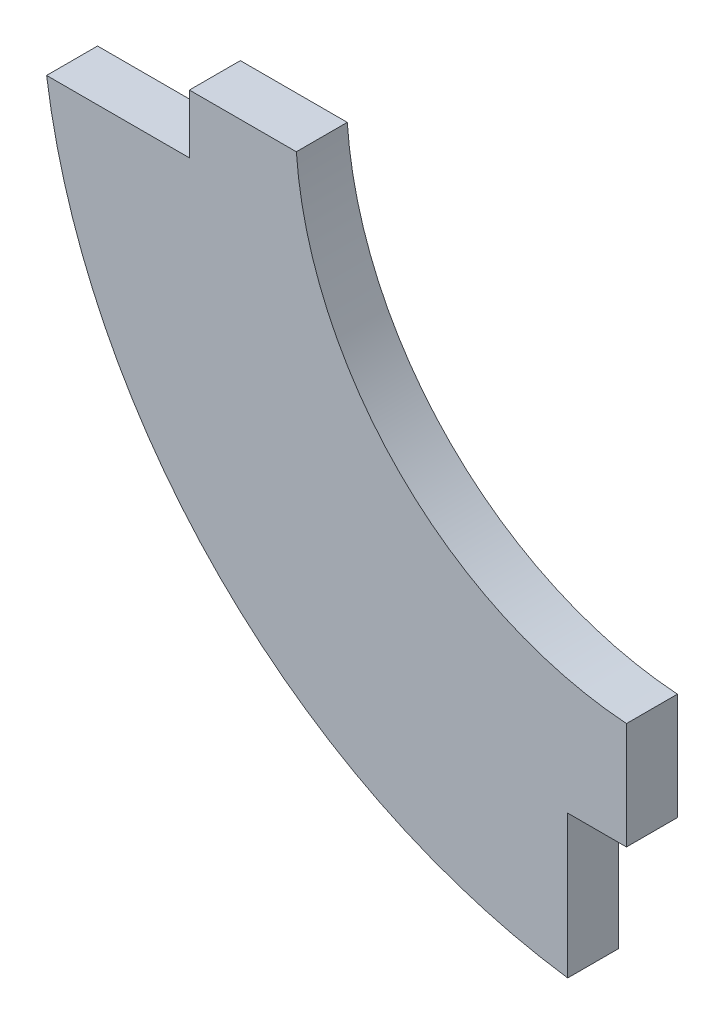
ISO-10303-21;
HEADER;
FILE_DESCRIPTION(('STEP AP214'),'2;1');
FILE_NAME('part.step','',(''),(''),'','','');
FILE_SCHEMA(('AUTOMOTIVE_DESIGN { 1 0 10303 214 1 1 1 1 }'));
ENDSEC;
DATA;
#1=APPLICATION_CONTEXT('core data for automotive mechanical design processes');
#2=APPLICATION_PROTOCOL_DEFINITION('international standard','automotive_design',2000,#1);
#3=PRODUCT_CONTEXT('',#1,'mechanical');
#4=PRODUCT('Part','Part','',(#3));
#5=PRODUCT_RELATED_PRODUCT_CATEGORY('part','',(#4));
#6=PRODUCT_DEFINITION_FORMATION('','',#4);
#7=PRODUCT_DEFINITION_CONTEXT('part definition',#1,'design');
#8=PRODUCT_DEFINITION('design','',#6,#7);
#9=PRODUCT_DEFINITION_SHAPE('','',#8);
#10=(LENGTH_UNIT() NAMED_UNIT(*) SI_UNIT(.MILLI.,.METRE.));
#11=(NAMED_UNIT(*) PLANE_ANGLE_UNIT() SI_UNIT($,.RADIAN.));
#12=(NAMED_UNIT(*) SI_UNIT($,.STERADIAN.) SOLID_ANGLE_UNIT());
#13=UNCERTAINTY_MEASURE_WITH_UNIT(LENGTH_MEASURE(1.E-05),#10,'distance_accuracy_value','');
#14=(GEOMETRIC_REPRESENTATION_CONTEXT(3) GLOBAL_UNCERTAINTY_ASSIGNED_CONTEXT((#13)) GLOBAL_UNIT_ASSIGNED_CONTEXT((#10,
#11,#12)) REPRESENTATION_CONTEXT('',''));
#15=CARTESIAN_POINT('',(0.,0.,0.));
#16=DIRECTION('',(0.,0.,1.));
#17=DIRECTION('',(1.,0.,0.));
#18=AXIS2_PLACEMENT_3D('',#15,#16,#17);
#19=CARTESIAN_POINT('',(-115.332,-20.9999999999975,6.35));
#20=DIRECTION('',(0.,-1.,0.));
#21=DIRECTION('',(1.,0.,0.));
#22=AXIS2_PLACEMENT_3D('',#19,#20,#21);
#23=PLANE('',#22);
#24=DIRECTION('',(-1.,0.,0.));
#25=VECTOR('',#24,1.);
#26=CARTESIAN_POINT('',(-115.332,-20.9999999999975,-6.35));
#27=LINE('',#26,#25);
#28=CARTESIAN_POINT('',(-115.332,-20.9999999999975,-6.35));
#29=VERTEX_POINT('',#28);
#30=CARTESIAN_POINT('',(-150.946215586878,-20.9999999999975,-6.35));
#31=VERTEX_POINT('',#30);
#32=EDGE_CURVE('E132',#29,#31,#27,.T.);
#33=ORIENTED_EDGE('',*,*,#32,.T.);
#34=DIRECTION('',(0.,0.,-1.));
#35=VECTOR('',#34,1.);
#36=CARTESIAN_POINT('',(-150.946215586878,-20.9999999999975,6.35));
#37=LINE('',#36,#35);
#38=CARTESIAN_POINT('',(-150.946215586878,-20.9999999999975,6.35));
#39=VERTEX_POINT('',#38);
#40=EDGE_CURVE('E11',#39,#31,#37,.T.);
#41=ORIENTED_EDGE('',*,*,#40,.F.);
#42=DIRECTION('',(-1.,0.,0.));
#43=VECTOR('',#42,1.);
#44=CARTESIAN_POINT('',(-115.332,-20.9999999999975,6.35));
#45=LINE('',#44,#43);
#46=CARTESIAN_POINT('',(-115.332,-20.9999999999975,6.35));
#47=VERTEX_POINT('',#46);
#48=EDGE_CURVE('E150',#47,#39,#45,.T.);
#49=ORIENTED_EDGE('',*,*,#48,.F.);
#50=DIRECTION('',(0.,0.,-1.));
#51=VECTOR('',#50,1.);
#52=CARTESIAN_POINT('',(-115.332,-20.9999999999975,6.35));
#53=LINE('',#52,#51);
#54=EDGE_CURVE('E131',#47,#29,#53,.T.);
#55=ORIENTED_EDGE('',*,*,#54,.T.);
#56=EDGE_LOOP('',(#33,#41,#49,#55));
#57=FACE_BOUND('',#56,.T.);
#58=ADVANCED_FACE('F34',(#57),#23,.F.);
#59=CARTESIAN_POINT('',(0.,0.,6.35));
#60=DIRECTION('',(0.,0.,-1.));
#61=DIRECTION('',(-1.,0.,0.));
#62=AXIS2_PLACEMENT_3D('',#59,#60,#61);
#63=CYLINDRICAL_SURFACE('',#62,152.4);
#64=CARTESIAN_POINT('',(0.,0.,-6.35));
#65=DIRECTION('',(0.,0.,1.));
#66=DIRECTION('',(1.,0.,0.));
#67=AXIS2_PLACEMENT_3D('',#64,#65,#66);
#68=CIRCLE('',#67,152.4);
#69=CARTESIAN_POINT('',(-20.9999999999946,-150.946215586878,-6.35));
#70=VERTEX_POINT('',#69);
#71=EDGE_CURVE('E135',#31,#70,#68,.T.);
#72=ORIENTED_EDGE('',*,*,#71,.T.);
#73=DIRECTION('',(0.,0.,-1.));
#74=VECTOR('',#73,1.);
#75=CARTESIAN_POINT('',(-20.9999999999946,-150.946215586878,6.35));
#76=LINE('',#75,#74);
#77=CARTESIAN_POINT('',(-20.9999999999946,-150.946215586878,6.35));
#78=VERTEX_POINT('',#77);
#79=EDGE_CURVE('E42',#78,#70,#76,.T.);
#80=ORIENTED_EDGE('',*,*,#79,.F.);
#81=CARTESIAN_POINT('',(0.,0.,6.35));
#82=DIRECTION('',(0.,0.,1.));
#83=DIRECTION('',(1.,0.,0.));
#84=AXIS2_PLACEMENT_3D('',#81,#82,#83);
#85=CIRCLE('',#84,152.4);
#86=EDGE_CURVE('E92',#39,#78,#85,.T.);
#87=ORIENTED_EDGE('',*,*,#86,.F.);
#88=ORIENTED_EDGE('',*,*,#40,.T.);
#89=EDGE_LOOP('',(#72,#80,#87,#88));
#90=FACE_BOUND('',#89,.T.);
#91=ADVANCED_FACE('F163',(#90),#63,.T.);
#92=CARTESIAN_POINT('',(-20.9999999999946,-115.332000000002,6.35));
#93=DIRECTION('',(1.,0.,0.));
#94=DIRECTION('',(0.,1.,0.));
#95=AXIS2_PLACEMENT_3D('',#92,#93,#94);
#96=PLANE('',#95);
#97=DIRECTION('',(0.,-1.,0.));
#98=VECTOR('',#97,1.);
#99=CARTESIAN_POINT('',(-20.9999999999946,-115.332000000002,-6.35));
#100=LINE('',#99,#98);
#101=CARTESIAN_POINT('',(-20.9999999999946,-115.332000000002,-6.35));
#102=VERTEX_POINT('',#101);
#103=EDGE_CURVE('E138',#102,#70,#100,.T.);
#104=ORIENTED_EDGE('',*,*,#103,.F.);
#105=DIRECTION('',(0.,0.,-1.));
#106=VECTOR('',#105,1.);
#107=CARTESIAN_POINT('',(-20.9999999999946,-115.332000000002,6.35));
#108=LINE('',#107,#106);
#109=CARTESIAN_POINT('',(-20.9999999999946,-115.332000000002,6.35));
#110=VERTEX_POINT('',#109);
#111=EDGE_CURVE('E156',#110,#102,#108,.T.);
#112=ORIENTED_EDGE('',*,*,#111,.F.);
#113=DIRECTION('',(0.,-1.,0.));
#114=VECTOR('',#113,1.);
#115=CARTESIAN_POINT('',(-20.9999999999946,-115.332000000002,6.35));
#116=LINE('',#115,#114);
#117=EDGE_CURVE('E162',#110,#78,#116,.T.);
#118=ORIENTED_EDGE('',*,*,#117,.T.);
#119=ORIENTED_EDGE('',*,*,#79,.T.);
#120=EDGE_LOOP('',(#104,#112,#118,#119));
#121=FACE_BOUND('',#120,.T.);
#122=ADVANCED_FACE('F160',(#121),#96,.T.);
#123=CARTESIAN_POINT('',(-6.35,-115.332,6.35));
#124=DIRECTION('',(1.13674712419E-13,-1.,0.));
#125=DIRECTION('',(1.,1.13674712419E-13,0.));
#126=AXIS2_PLACEMENT_3D('',#123,#124,#125);
#127=PLANE('',#126);
#128=DIRECTION('',(-1.,-1.13674712419E-13,0.));
#129=VECTOR('',#128,1.);
#130=CARTESIAN_POINT('',(-6.35,-115.332,-6.35));
#131=LINE('',#130,#129);
#132=CARTESIAN_POINT('',(-6.35,-115.332,-6.35));
#133=VERTEX_POINT('',#132);
#134=EDGE_CURVE('E141',#133,#102,#131,.T.);
#135=ORIENTED_EDGE('',*,*,#134,.F.);
#136=DIRECTION('',(0.,0.,-1.));
#137=VECTOR('',#136,1.);
#138=CARTESIAN_POINT('',(-6.35,-115.332,6.35));
#139=LINE('',#138,#137);
#140=CARTESIAN_POINT('',(-6.35,-115.332,6.35));
#141=VERTEX_POINT('',#140);
#142=EDGE_CURVE('E154',#141,#133,#139,.T.);
#143=ORIENTED_EDGE('',*,*,#142,.F.);
#144=DIRECTION('',(-1.,-1.13674712419E-13,0.));
#145=VECTOR('',#144,1.);
#146=CARTESIAN_POINT('',(-6.35,-115.332,6.35));
#147=LINE('',#146,#145);
#148=EDGE_CURVE('E126',#141,#110,#147,.T.);
#149=ORIENTED_EDGE('',*,*,#148,.T.);
#150=ORIENTED_EDGE('',*,*,#111,.T.);
#151=EDGE_LOOP('',(#135,#143,#149,#150));
#152=FACE_BOUND('',#151,.T.);
#153=ADVANCED_FACE('F171',(#152),#127,.T.);
#154=CARTESIAN_POINT('',(-6.35000000000064,-88.6729242779327,6.35));
#155=DIRECTION('',(1.,0.,0.));
#156=DIRECTION('',(0.,1.,0.));
#157=AXIS2_PLACEMENT_3D('',#154,#155,#156);
#158=PLANE('',#157);
#159=DIRECTION('',(0.,-1.,0.));
#160=VECTOR('',#159,1.);
#161=CARTESIAN_POINT('',(-6.35000000000064,-88.6729242779327,-6.35));
#162=LINE('',#161,#160);
#163=CARTESIAN_POINT('',(-6.35000000000064,-88.6729242779327,-6.35));
#164=VERTEX_POINT('',#163);
#165=EDGE_CURVE('E144',#164,#133,#162,.T.);
#166=ORIENTED_EDGE('',*,*,#165,.F.);
#167=DIRECTION('',(0.,0.,-1.));
#168=VECTOR('',#167,1.);
#169=CARTESIAN_POINT('',(-6.35000000000064,-88.6729242779327,6.35));
#170=LINE('',#169,#168);
#171=CARTESIAN_POINT('',(-6.35000000000064,-88.6729242779327,6.35));
#172=VERTEX_POINT('',#171);
#173=EDGE_CURVE('E114',#172,#164,#170,.T.);
#174=ORIENTED_EDGE('',*,*,#173,.F.);
#175=DIRECTION('',(0.,-1.,0.));
#176=VECTOR('',#175,1.);
#177=CARTESIAN_POINT('',(-6.35000000000064,-88.6729242779327,6.35));
#178=LINE('',#177,#176);
#179=EDGE_CURVE('E124',#172,#141,#178,.T.);
#180=ORIENTED_EDGE('',*,*,#179,.T.);
#181=ORIENTED_EDGE('',*,*,#142,.T.);
#182=EDGE_LOOP('',(#166,#174,#180,#181));
#183=FACE_BOUND('',#182,.T.);
#184=ADVANCED_FACE('F199',(#183),#158,.T.);
#185=CARTESIAN_POINT('',(0.,0.,6.35));
#186=DIRECTION('',(0.,0.,-1.));
#187=DIRECTION('',(-1.,0.,0.));
#188=AXIS2_PLACEMENT_3D('',#185,#186,#187);
#189=CYLINDRICAL_SURFACE('',#188,88.9);
#190=CARTESIAN_POINT('',(0.,0.,-6.35));
#191=DIRECTION('',(0.,0.,1.));
#192=DIRECTION('',(1.,0.,0.));
#193=AXIS2_PLACEMENT_3D('',#190,#191,#192);
#194=CIRCLE('',#193,88.9);
#195=CARTESIAN_POINT('',(-88.6729242779328,-6.35000000000014,-6.35));
#196=VERTEX_POINT('',#195);
#197=EDGE_CURVE('E113',#196,#164,#194,.T.);
#198=ORIENTED_EDGE('',*,*,#197,.F.);
#199=DIRECTION('',(0.,0.,-1.));
#200=VECTOR('',#199,1.);
#201=CARTESIAN_POINT('',(-88.6729242779328,-6.35000000000014,6.35));
#202=LINE('',#201,#200);
#203=CARTESIAN_POINT('',(-88.6729242779328,-6.35000000000014,6.35));
#204=VERTEX_POINT('',#203);
#205=EDGE_CURVE('E107',#204,#196,#202,.T.);
#206=ORIENTED_EDGE('',*,*,#205,.F.);
#207=CARTESIAN_POINT('',(0.,0.,6.35));
#208=DIRECTION('',(0.,0.,1.));
#209=DIRECTION('',(1.,0.,0.));
#210=AXIS2_PLACEMENT_3D('',#207,#208,#209);
#211=CIRCLE('',#210,88.9);
#212=EDGE_CURVE('E111',#204,#172,#211,.T.);
#213=ORIENTED_EDGE('',*,*,#212,.T.);
#214=ORIENTED_EDGE('',*,*,#173,.T.);
#215=EDGE_LOOP('',(#198,#206,#213,#214));
#216=FACE_BOUND('',#215,.T.);
#217=ADVANCED_FACE('F109',(#216),#189,.F.);
#218=CARTESIAN_POINT('',(-88.6729242779328,-6.35000000000017,6.35));
#219=DIRECTION('',(0.,-1.,0.));
#220=DIRECTION('',(1.,0.,0.));
#221=AXIS2_PLACEMENT_3D('',#218,#219,#220);
#222=PLANE('',#221);
#223=DIRECTION('',(-1.,0.,0.));
#224=VECTOR('',#223,1.);
#225=CARTESIAN_POINT('',(-88.6729242779328,-6.35000000000017,-6.35));
#226=LINE('',#225,#224);
#227=CARTESIAN_POINT('',(-115.332,-6.35,-6.35));
#228=VERTEX_POINT('',#227);
#229=EDGE_CURVE('E78',#196,#228,#226,.T.);
#230=ORIENTED_EDGE('',*,*,#229,.T.);
#231=DIRECTION('',(0.,0.,-1.));
#232=VECTOR('',#231,1.);
#233=CARTESIAN_POINT('',(-115.332,-6.35,6.35));
#234=LINE('',#233,#232);
#235=CARTESIAN_POINT('',(-115.332,-6.35,6.35));
#236=VERTEX_POINT('',#235);
#237=EDGE_CURVE('E115',#236,#228,#234,.T.);
#238=ORIENTED_EDGE('',*,*,#237,.F.);
#239=DIRECTION('',(-1.,0.,0.));
#240=VECTOR('',#239,1.);
#241=CARTESIAN_POINT('',(-88.6729242779328,-6.35000000000017,6.35));
#242=LINE('',#241,#240);
#243=EDGE_CURVE('E117',#204,#236,#242,.T.);
#244=ORIENTED_EDGE('',*,*,#243,.F.);
#245=ORIENTED_EDGE('',*,*,#205,.T.);
#246=EDGE_LOOP('',(#230,#238,#244,#245));
#247=FACE_BOUND('',#246,.T.);
#248=ADVANCED_FACE('F118',(#247),#222,.F.);
#249=CARTESIAN_POINT('',(-115.332,-6.35,6.35));
#250=DIRECTION('',(1.,0.,0.));
#251=DIRECTION('',(0.,1.,0.));
#252=AXIS2_PLACEMENT_3D('',#249,#250,#251);
#253=PLANE('',#252);
#254=DIRECTION('',(0.,-1.,0.));
#255=VECTOR('',#254,1.);
#256=CARTESIAN_POINT('',(-115.332,-6.35,-6.35));
#257=LINE('',#256,#255);
#258=EDGE_CURVE('E84',#228,#29,#257,.T.);
#259=ORIENTED_EDGE('',*,*,#258,.T.);
#260=ORIENTED_EDGE('',*,*,#54,.F.);
#261=DIRECTION('',(0.,-1.,0.));
#262=VECTOR('',#261,1.);
#263=CARTESIAN_POINT('',(-115.332,-6.35,6.35));
#264=LINE('',#263,#262);
#265=EDGE_CURVE('E50',#236,#47,#264,.T.);
#266=ORIENTED_EDGE('',*,*,#265,.F.);
#267=ORIENTED_EDGE('',*,*,#237,.T.);
#268=EDGE_LOOP('',(#259,#260,#266,#267));
#269=FACE_BOUND('',#268,.T.);
#270=ADVANCED_FACE('F178',(#269),#253,.F.);
#271=CARTESIAN_POINT('',(0.,0.,6.35));
#272=DIRECTION('',(0.,0.,1.));
#273=DIRECTION('',(1.,0.,0.));
#274=AXIS2_PLACEMENT_3D('',#271,#272,#273);
#275=PLANE('',#274);
#276=ORIENTED_EDGE('',*,*,#48,.T.);
#277=ORIENTED_EDGE('',*,*,#86,.T.);
#278=ORIENTED_EDGE('',*,*,#117,.F.);
#279=ORIENTED_EDGE('',*,*,#148,.F.);
#280=ORIENTED_EDGE('',*,*,#179,.F.);
#281=ORIENTED_EDGE('',*,*,#212,.F.);
#282=ORIENTED_EDGE('',*,*,#243,.T.);
#283=ORIENTED_EDGE('',*,*,#265,.T.);
#284=EDGE_LOOP('',(#276,#277,#278,#279,#280,#281,#282,#283));
#285=FACE_BOUND('',#284,.T.);
#286=ADVANCED_FACE('F121',(#285),#275,.T.);
#287=CARTESIAN_POINT('',(0.,0.,-6.35));
#288=DIRECTION('',(0.,0.,1.));
#289=DIRECTION('',(1.,0.,0.));
#290=AXIS2_PLACEMENT_3D('',#287,#288,#289);
#291=PLANE('',#290);
#292=ORIENTED_EDGE('',*,*,#32,.F.);
#293=ORIENTED_EDGE('',*,*,#258,.F.);
#294=ORIENTED_EDGE('',*,*,#229,.F.);
#295=ORIENTED_EDGE('',*,*,#197,.T.);
#296=ORIENTED_EDGE('',*,*,#165,.T.);
#297=ORIENTED_EDGE('',*,*,#134,.T.);
#298=ORIENTED_EDGE('',*,*,#103,.T.);
#299=ORIENTED_EDGE('',*,*,#71,.F.);
#300=EDGE_LOOP('',(#292,#293,#294,#295,#296,#297,#298,#299));
#301=FACE_BOUND('',#300,.T.);
#302=ADVANCED_FACE('F167',(#301),#291,.F.);
#303=CLOSED_SHELL('',(#58,#91,#122,#153,#184,#217,#248,#270,#286,#302));
#304=MANIFOLD_SOLID_BREP('B2',#303);
#305=ADVANCED_BREP_SHAPE_REPRESENTATION('',(#18,#304),#14);
#306=SHAPE_DEFINITION_REPRESENTATION(#9,#305);
ENDSEC;
END-ISO-10303-21;
